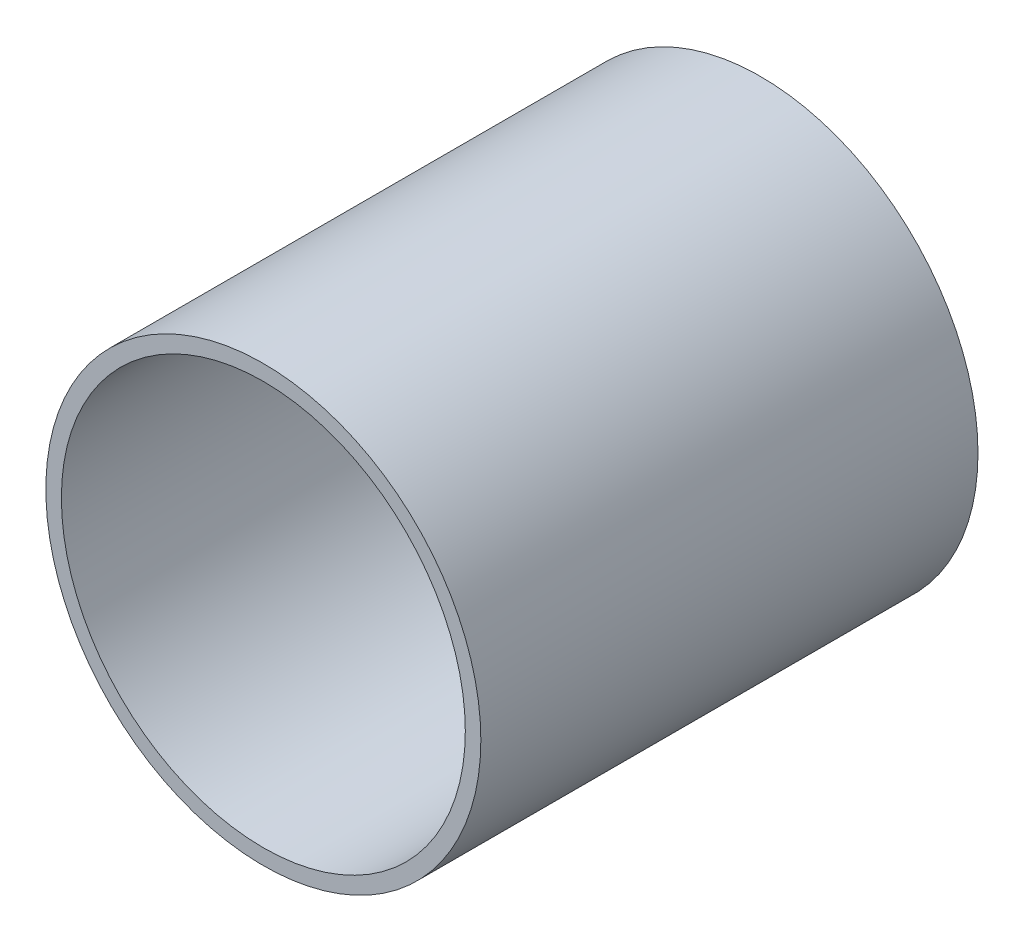
ISO-10303-21;
HEADER;
FILE_DESCRIPTION(('STEP AP214'),'2;1');
FILE_NAME('part.step','',(''),(''),'','','');
FILE_SCHEMA(('AUTOMOTIVE_DESIGN { 1 0 10303 214 1 1 1 1 }'));
ENDSEC;
DATA;
#1=APPLICATION_CONTEXT('core data for automotive mechanical design processes');
#2=APPLICATION_PROTOCOL_DEFINITION('international standard','automotive_design',2000,#1);
#3=PRODUCT_CONTEXT('',#1,'mechanical');
#4=PRODUCT('Part','Part','',(#3));
#5=PRODUCT_RELATED_PRODUCT_CATEGORY('part','',(#4));
#6=PRODUCT_DEFINITION_FORMATION('','',#4);
#7=PRODUCT_DEFINITION_CONTEXT('part definition',#1,'design');
#8=PRODUCT_DEFINITION('design','',#6,#7);
#9=PRODUCT_DEFINITION_SHAPE('','',#8);
#10=(LENGTH_UNIT() NAMED_UNIT(*) SI_UNIT(.MILLI.,.METRE.));
#11=(NAMED_UNIT(*) PLANE_ANGLE_UNIT() SI_UNIT($,.RADIAN.));
#12=(NAMED_UNIT(*) SI_UNIT($,.STERADIAN.) SOLID_ANGLE_UNIT());
#13=UNCERTAINTY_MEASURE_WITH_UNIT(LENGTH_MEASURE(1.E-05),#10,'distance_accuracy_value','');
#14=(GEOMETRIC_REPRESENTATION_CONTEXT(3) GLOBAL_UNCERTAINTY_ASSIGNED_CONTEXT((#13)) GLOBAL_UNIT_ASSIGNED_CONTEXT((#10,
#11,#12)) REPRESENTATION_CONTEXT('',''));
#15=CARTESIAN_POINT('',(0.,0.,0.));
#16=DIRECTION('',(0.,0.,1.));
#17=DIRECTION('',(1.,0.,0.));
#18=AXIS2_PLACEMENT_3D('',#15,#16,#17);
#19=CARTESIAN_POINT('',(0.,0.,203.2));
#20=DIRECTION('',(0.,0.,1.));
#21=DIRECTION('',(1.,0.,0.));
#22=AXIS2_PLACEMENT_3D('',#19,#20,#21);
#23=PLANE('',#22);
#24=CARTESIAN_POINT('',(0.,0.,203.2));
#25=DIRECTION('',(0.,0.,1.));
#26=DIRECTION('',(1.,0.,0.));
#27=AXIS2_PLACEMENT_3D('',#24,#25,#26);
#28=CIRCLE('',#27,88.9);
#29=CARTESIAN_POINT('',(88.9,0.,203.2));
#30=VERTEX_POINT('',#29);
#31=EDGE_CURVE('E10',#30,#30,#28,.T.);
#32=ORIENTED_EDGE('',*,*,#31,.T.);
#33=EDGE_LOOP('',(#32));
#34=FACE_BOUND('',#33,.T.);
#35=CARTESIAN_POINT('',(0.,0.,203.2));
#36=DIRECTION('',(0.,0.,1.));
#37=DIRECTION('',(1.,0.,0.));
#38=AXIS2_PLACEMENT_3D('',#35,#36,#37);
#39=CIRCLE('',#38,82.55);
#40=CARTESIAN_POINT('',(82.55,0.,203.2));
#41=VERTEX_POINT('',#40);
#42=EDGE_CURVE('E50',#41,#41,#39,.T.);
#43=ORIENTED_EDGE('',*,*,#42,.F.);
#44=EDGE_LOOP('',(#43));
#45=FACE_BOUND('',#44,.T.);
#46=ADVANCED_FACE('F39',(#34,#45),#23,.T.);
#47=CARTESIAN_POINT('',(0.,0.,0.));
#48=DIRECTION('',(0.,0.,1.));
#49=DIRECTION('',(1.,0.,0.));
#50=AXIS2_PLACEMENT_3D('',#47,#48,#49);
#51=PLANE('',#50);
#52=CARTESIAN_POINT('',(0.,0.,0.));
#53=DIRECTION('',(0.,0.,1.));
#54=DIRECTION('',(1.,0.,0.));
#55=AXIS2_PLACEMENT_3D('',#52,#53,#54);
#56=CIRCLE('',#55,88.9);
#57=CARTESIAN_POINT('',(88.9,0.,0.));
#58=VERTEX_POINT('',#57);
#59=EDGE_CURVE('E43',#58,#58,#56,.T.);
#60=ORIENTED_EDGE('',*,*,#59,.F.);
#61=EDGE_LOOP('',(#60));
#62=FACE_BOUND('',#61,.T.);
#63=CARTESIAN_POINT('',(0.,0.,0.));
#64=DIRECTION('',(0.,0.,1.));
#65=DIRECTION('',(1.,0.,0.));
#66=AXIS2_PLACEMENT_3D('',#63,#64,#65);
#67=CIRCLE('',#66,82.55);
#68=CARTESIAN_POINT('',(82.55,0.,0.));
#69=VERTEX_POINT('',#68);
#70=EDGE_CURVE('E52',#69,#69,#67,.T.);
#71=ORIENTED_EDGE('',*,*,#70,.T.);
#72=EDGE_LOOP('',(#71));
#73=FACE_BOUND('',#72,.T.);
#74=ADVANCED_FACE('F62',(#62,#73),#51,.F.);
#75=CARTESIAN_POINT('',(0.,0.,203.2));
#76=DIRECTION('',(0.,0.,-1.));
#77=DIRECTION('',(-1.,0.,0.));
#78=AXIS2_PLACEMENT_3D('',#75,#76,#77);
#79=CYLINDRICAL_SURFACE('',#78,88.9);
#80=ORIENTED_EDGE('',*,*,#31,.F.);
#81=EDGE_LOOP('',(#80));
#82=FACE_BOUND('',#81,.T.);
#83=ORIENTED_EDGE('',*,*,#59,.T.);
#84=EDGE_LOOP('',(#83));
#85=FACE_BOUND('',#84,.T.);
#86=ADVANCED_FACE('F41',(#82,#85),#79,.T.);
#87=CARTESIAN_POINT('',(0.,0.,203.2));
#88=DIRECTION('',(0.,0.,-1.));
#89=DIRECTION('',(-1.,0.,0.));
#90=AXIS2_PLACEMENT_3D('',#87,#88,#89);
#91=CYLINDRICAL_SURFACE('',#90,82.55);
#92=ORIENTED_EDGE('',*,*,#42,.T.);
#93=EDGE_LOOP('',(#92));
#94=FACE_BOUND('',#93,.T.);
#95=ORIENTED_EDGE('',*,*,#70,.F.);
#96=EDGE_LOOP('',(#95));
#97=FACE_BOUND('',#96,.T.);
#98=ADVANCED_FACE('F58',(#94,#97),#91,.F.);
#99=CLOSED_SHELL('',(#46,#74,#86,#98));
#100=MANIFOLD_SOLID_BREP('B2',#99);
#101=ADVANCED_BREP_SHAPE_REPRESENTATION('',(#18,#100),#14);
#102=SHAPE_DEFINITION_REPRESENTATION(#9,#101);
ENDSEC;
END-ISO-10303-21;
